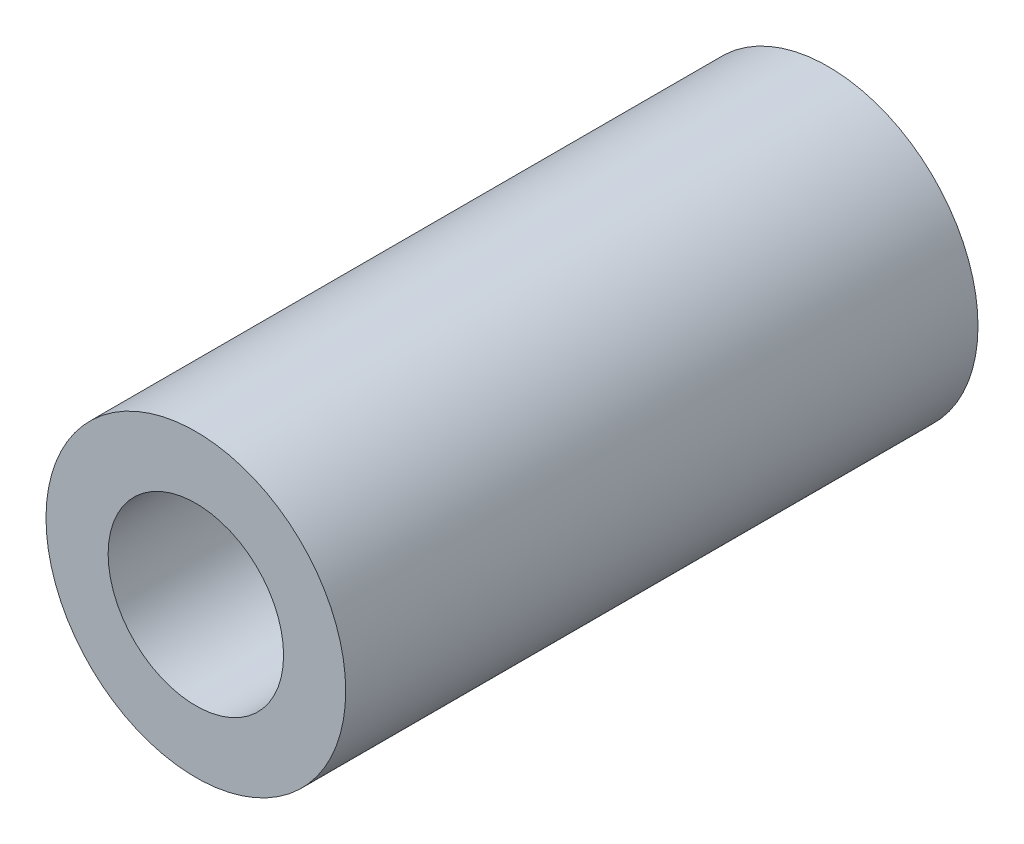
ISO-10303-21;
HEADER;
FILE_DESCRIPTION(('STEP AP214'),'2;1');
FILE_NAME('part.step','',(''),(''),'','','');
FILE_SCHEMA(('AUTOMOTIVE_DESIGN { 1 0 10303 214 1 1 1 1 }'));
ENDSEC;
DATA;
#1=APPLICATION_CONTEXT('core data for automotive mechanical design processes');
#2=APPLICATION_PROTOCOL_DEFINITION('international standard','automotive_design',2000,#1);
#3=PRODUCT_CONTEXT('',#1,'mechanical');
#4=PRODUCT('Part','Part','',(#3));
#5=PRODUCT_RELATED_PRODUCT_CATEGORY('part','',(#4));
#6=PRODUCT_DEFINITION_FORMATION('','',#4);
#7=PRODUCT_DEFINITION_CONTEXT('part definition',#1,'design');
#8=PRODUCT_DEFINITION('design','',#6,#7);
#9=PRODUCT_DEFINITION_SHAPE('','',#8);
#10=(LENGTH_UNIT() NAMED_UNIT(*) SI_UNIT(.MILLI.,.METRE.));
#11=(NAMED_UNIT(*) PLANE_ANGLE_UNIT() SI_UNIT($,.RADIAN.));
#12=(NAMED_UNIT(*) SI_UNIT($,.STERADIAN.) SOLID_ANGLE_UNIT());
#13=UNCERTAINTY_MEASURE_WITH_UNIT(LENGTH_MEASURE(1.E-05),#10,'distance_accuracy_value','');
#14=(GEOMETRIC_REPRESENTATION_CONTEXT(3) GLOBAL_UNCERTAINTY_ASSIGNED_CONTEXT((#13)) GLOBAL_UNIT_ASSIGNED_CONTEXT((#10,
#11,#12)) REPRESENTATION_CONTEXT('',''));
#15=CARTESIAN_POINT('',(0.,0.,0.));
#16=DIRECTION('',(0.,0.,1.));
#17=DIRECTION('',(1.,0.,0.));
#18=AXIS2_PLACEMENT_3D('',#15,#16,#17);
#19=CARTESIAN_POINT('',(0.,0.,-50.5));
#20=DIRECTION('',(0.,0.,1.));
#21=DIRECTION('',(1.,0.,0.));
#22=AXIS2_PLACEMENT_3D('',#19,#20,#21);
#23=CYLINDRICAL_SURFACE('',#22,20.5);
#24=CARTESIAN_POINT('',(0.,0.,-50.5));
#25=DIRECTION('',(0.,0.,1.));
#26=DIRECTION('',(1.,0.,0.));
#27=AXIS2_PLACEMENT_3D('',#24,#25,#26);
#28=CIRCLE('',#27,20.5);
#29=CARTESIAN_POINT('',(20.5,0.,-50.5));
#30=VERTEX_POINT('',#29);
#31=EDGE_CURVE('E10',#30,#30,#28,.T.);
#32=ORIENTED_EDGE('',*,*,#31,.T.);
#33=EDGE_LOOP('',(#32));
#34=FACE_BOUND('',#33,.T.);
#35=CARTESIAN_POINT('',(0.,0.,36.));
#36=DIRECTION('',(0.,0.,1.));
#37=DIRECTION('',(1.,0.,0.));
#38=AXIS2_PLACEMENT_3D('',#35,#36,#37);
#39=CIRCLE('',#38,20.5);
#40=CARTESIAN_POINT('',(20.5,0.,36.));
#41=VERTEX_POINT('',#40);
#42=EDGE_CURVE('E43',#41,#41,#39,.T.);
#43=ORIENTED_EDGE('',*,*,#42,.F.);
#44=EDGE_LOOP('',(#43));
#45=FACE_BOUND('',#44,.T.);
#46=ADVANCED_FACE('F33',(#34,#45),#23,.T.);
#47=CARTESIAN_POINT('',(0.,0.,-50.5));
#48=DIRECTION('',(0.,0.,1.));
#49=DIRECTION('',(1.,0.,0.));
#50=AXIS2_PLACEMENT_3D('',#47,#48,#49);
#51=PLANE('',#50);
#52=CARTESIAN_POINT('',(0.,0.,-50.5));
#53=DIRECTION('',(0.,0.,1.));
#54=DIRECTION('',(1.,0.,0.));
#55=AXIS2_PLACEMENT_3D('',#52,#53,#54);
#56=CIRCLE('',#55,12.);
#57=CARTESIAN_POINT('',(12.,0.,-50.5));
#58=VERTEX_POINT('',#57);
#59=EDGE_CURVE('E39',#58,#58,#56,.T.);
#60=ORIENTED_EDGE('',*,*,#59,.T.);
#61=EDGE_LOOP('',(#60));
#62=FACE_BOUND('',#61,.T.);
#63=ORIENTED_EDGE('',*,*,#31,.F.);
#64=EDGE_LOOP('',(#63));
#65=FACE_BOUND('',#64,.T.);
#66=ADVANCED_FACE('F62',(#62,#65),#51,.F.);
#67=CARTESIAN_POINT('',(0.,0.,-50.5));
#68=DIRECTION('',(0.,0.,1.));
#69=DIRECTION('',(1.,0.,0.));
#70=AXIS2_PLACEMENT_3D('',#67,#68,#69);
#71=CYLINDRICAL_SURFACE('',#70,12.);
#72=ORIENTED_EDGE('',*,*,#59,.F.);
#73=EDGE_LOOP('',(#72));
#74=FACE_BOUND('',#73,.T.);
#75=CARTESIAN_POINT('',(0.,0.,36.));
#76=DIRECTION('',(0.,0.,1.));
#77=DIRECTION('',(1.,0.,0.));
#78=AXIS2_PLACEMENT_3D('',#75,#76,#77);
#79=CIRCLE('',#78,12.);
#80=CARTESIAN_POINT('',(12.,0.,36.));
#81=VERTEX_POINT('',#80);
#82=EDGE_CURVE('E47',#81,#81,#79,.T.);
#83=ORIENTED_EDGE('',*,*,#82,.T.);
#84=EDGE_LOOP('',(#83));
#85=FACE_BOUND('',#84,.T.);
#86=ADVANCED_FACE('F53',(#74,#85),#71,.F.);
#87=CARTESIAN_POINT('',(0.,0.,36.));
#88=DIRECTION('',(0.,0.,1.));
#89=DIRECTION('',(1.,0.,0.));
#90=AXIS2_PLACEMENT_3D('',#87,#88,#89);
#91=PLANE('',#90);
#92=ORIENTED_EDGE('',*,*,#42,.T.);
#93=EDGE_LOOP('',(#92));
#94=FACE_BOUND('',#93,.T.);
#95=ORIENTED_EDGE('',*,*,#82,.F.);
#96=EDGE_LOOP('',(#95));
#97=FACE_BOUND('',#96,.T.);
#98=ADVANCED_FACE('F55',(#94,#97),#91,.T.);
#99=CLOSED_SHELL('',(#46,#66,#86,#98));
#100=MANIFOLD_SOLID_BREP('B2',#99);
#101=ADVANCED_BREP_SHAPE_REPRESENTATION('',(#18,#100),#14);
#102=SHAPE_DEFINITION_REPRESENTATION(#9,#101);
ENDSEC;
END-ISO-10303-21;
